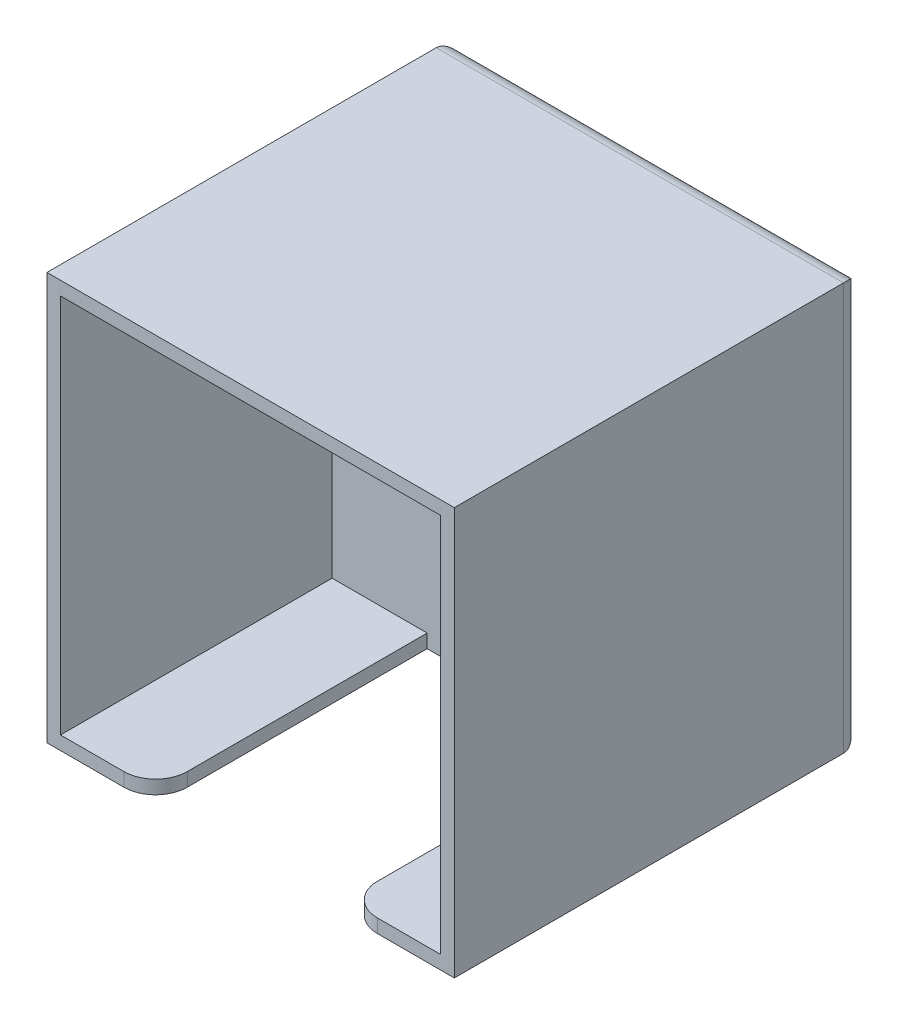
ISO-10303-21;
HEADER;
FILE_DESCRIPTION(('STEP AP214'),'2;1');
FILE_NAME('part.step','',(''),(''),'','','');
FILE_SCHEMA(('AUTOMOTIVE_DESIGN { 1 0 10303 214 1 1 1 1 }'));
ENDSEC;
DATA;
#1=APPLICATION_CONTEXT('core data for automotive mechanical design processes');
#2=APPLICATION_PROTOCOL_DEFINITION('international standard','automotive_design',2000,#1);
#3=PRODUCT_CONTEXT('',#1,'mechanical');
#4=PRODUCT('Part','Part','',(#3));
#5=PRODUCT_RELATED_PRODUCT_CATEGORY('part','',(#4));
#6=PRODUCT_DEFINITION_FORMATION('','',#4);
#7=PRODUCT_DEFINITION_CONTEXT('part definition',#1,'design');
#8=PRODUCT_DEFINITION('design','',#6,#7);
#9=PRODUCT_DEFINITION_SHAPE('','',#8);
#10=(LENGTH_UNIT() NAMED_UNIT(*) SI_UNIT(.MILLI.,.METRE.));
#11=(NAMED_UNIT(*) PLANE_ANGLE_UNIT() SI_UNIT($,.RADIAN.));
#12=(NAMED_UNIT(*) SI_UNIT($,.STERADIAN.) SOLID_ANGLE_UNIT());
#13=UNCERTAINTY_MEASURE_WITH_UNIT(LENGTH_MEASURE(1.E-05),#10,'distance_accuracy_value','');
#14=(GEOMETRIC_REPRESENTATION_CONTEXT(3) GLOBAL_UNCERTAINTY_ASSIGNED_CONTEXT((#13)) GLOBAL_UNIT_ASSIGNED_CONTEXT((#10,
#11,#12)) REPRESENTATION_CONTEXT('',''));
#15=CARTESIAN_POINT('',(0.,0.,0.));
#16=DIRECTION('',(0.,0.,1.));
#17=DIRECTION('',(1.,0.,0.));
#18=AXIS2_PLACEMENT_3D('',#15,#16,#17);
#19=CARTESIAN_POINT('',(-21.,-21.,15.));
#20=DIRECTION('',(0.,-1.,0.));
#21=DIRECTION('',(0.,0.,-1.));
#22=AXIS2_PLACEMENT_3D('',#19,#20,#21);
#23=PLANE('',#22);
#24=DIRECTION('',(0.,0.,-1.));
#25=VECTOR('',#24,1.);
#26=CARTESIAN_POINT('',(10.5,-21.,15.));
#27=LINE('',#26,#25);
#28=CARTESIAN_POINT('',(10.5,-21.,41.5));
#29=VERTEX_POINT('',#28);
#30=CARTESIAN_POINT('',(10.5,-21.,15.));
#31=VERTEX_POINT('',#30);
#32=EDGE_CURVE('E282',#29,#31,#27,.T.);
#33=ORIENTED_EDGE('',*,*,#32,.F.);
#34=CARTESIAN_POINT('',(14.,-21.,41.5));
#35=DIRECTION('',(0.,-1.,0.));
#36=DIRECTION('',(0.,0.,-1.));
#37=AXIS2_PLACEMENT_3D('',#34,#35,#36);
#38=CIRCLE('',#37,3.5);
#39=CARTESIAN_POINT('',(14.,-21.,45.));
#40=VERTEX_POINT('',#39);
#41=EDGE_CURVE('E248',#29,#40,#38,.F.);
#42=ORIENTED_EDGE('',*,*,#41,.T.);
#43=DIRECTION('',(1.,0.,0.));
#44=VECTOR('',#43,1.);
#45=CARTESIAN_POINT('',(-21.,-21.,45.));
#46=LINE('',#45,#44);
#47=CARTESIAN_POINT('',(21.,-21.,45.));
#48=VERTEX_POINT('',#47);
#49=EDGE_CURVE('E205',#40,#48,#46,.T.);
#50=ORIENTED_EDGE('',*,*,#49,.T.);
#51=DIRECTION('',(0.,0.,1.));
#52=VECTOR('',#51,1.);
#53=CARTESIAN_POINT('',(21.,-21.,15.));
#54=LINE('',#53,#52);
#55=CARTESIAN_POINT('',(21.,-21.,15.));
#56=VERTEX_POINT('',#55);
#57=EDGE_CURVE('E208',#56,#48,#54,.T.);
#58=ORIENTED_EDGE('',*,*,#57,.F.);
#59=DIRECTION('',(1.,0.,0.));
#60=VECTOR('',#59,1.);
#61=CARTESIAN_POINT('',(-21.,-21.,15.));
#62=LINE('',#61,#60);
#63=EDGE_CURVE('E195',#31,#56,#62,.T.);
#64=ORIENTED_EDGE('',*,*,#63,.F.);
#65=EDGE_LOOP('',(#33,#42,#50,#58,#64));
#66=FACE_BOUND('',#65,.T.);
#67=ADVANCED_FACE('F41',(#66),#23,.F.);
#68=CARTESIAN_POINT('',(22.5,-22.5,45.));
#69=DIRECTION('',(-1.,0.,0.));
#70=DIRECTION('',(0.,0.,1.));
#71=AXIS2_PLACEMENT_3D('',#68,#69,#70);
#72=PLANE('',#71);
#73=DIRECTION('',(0.,0.,-1.));
#74=VECTOR('',#73,1.);
#75=CARTESIAN_POINT('',(22.5,-22.5,45.));
#76=LINE('',#75,#74);
#77=CARTESIAN_POINT('',(22.5,-22.5,45.));
#78=VERTEX_POINT('',#77);
#79=CARTESIAN_POINT('',(22.5,-22.5,2.00000000000002));
#80=VERTEX_POINT('',#79);
#81=EDGE_CURVE('E228',#78,#80,#76,.T.);
#82=ORIENTED_EDGE('',*,*,#81,.T.);
#83=DIRECTION('',(0.,1.,0.));
#84=VECTOR('',#83,1.);
#85=CARTESIAN_POINT('',(22.5,22.5,2.));
#86=LINE('',#85,#84);
#87=CARTESIAN_POINT('',(22.5,22.5,2.00000000000002));
#88=VERTEX_POINT('',#87);
#89=EDGE_CURVE('E50',#80,#88,#86,.T.);
#90=ORIENTED_EDGE('',*,*,#89,.T.);
#91=DIRECTION('',(0.,0.,-1.));
#92=VECTOR('',#91,1.);
#93=CARTESIAN_POINT('',(22.5,22.5,45.));
#94=LINE('',#93,#92);
#95=CARTESIAN_POINT('',(22.5,22.5,45.));
#96=VERTEX_POINT('',#95);
#97=EDGE_CURVE('E235',#96,#88,#94,.T.);
#98=ORIENTED_EDGE('',*,*,#97,.F.);
#99=DIRECTION('',(0.,1.,0.));
#100=VECTOR('',#99,1.);
#101=CARTESIAN_POINT('',(22.5,-22.5,45.));
#102=LINE('',#101,#100);
#103=EDGE_CURVE('E211',#78,#96,#102,.T.);
#104=ORIENTED_EDGE('',*,*,#103,.F.);
#105=EDGE_LOOP('',(#82,#90,#98,#104));
#106=FACE_BOUND('',#105,.T.);
#107=ADVANCED_FACE('F340',(#106),#72,.F.);
#108=CARTESIAN_POINT('',(-22.5,22.5,45.));
#109=DIRECTION('',(0.,-1.,0.));
#110=DIRECTION('',(0.,0.,-1.));
#111=AXIS2_PLACEMENT_3D('',#108,#109,#110);
#112=PLANE('',#111);
#113=ORIENTED_EDGE('',*,*,#97,.T.);
#114=DIRECTION('',(-1.,0.,0.));
#115=VECTOR('',#114,1.);
#116=CARTESIAN_POINT('',(-22.5,22.5,2.));
#117=LINE('',#116,#115);
#118=CARTESIAN_POINT('',(-22.5,22.5,2.00000000000002));
#119=VERTEX_POINT('',#118);
#120=EDGE_CURVE('E265',#88,#119,#117,.T.);
#121=ORIENTED_EDGE('',*,*,#120,.T.);
#122=DIRECTION('',(0.,0.,-1.));
#123=VECTOR('',#122,1.);
#124=CARTESIAN_POINT('',(-22.5,22.5,45.));
#125=LINE('',#124,#123);
#126=CARTESIAN_POINT('',(-22.5,22.5,45.));
#127=VERTEX_POINT('',#126);
#128=EDGE_CURVE('E232',#127,#119,#125,.T.);
#129=ORIENTED_EDGE('',*,*,#128,.F.);
#130=DIRECTION('',(-1.,0.,0.));
#131=VECTOR('',#130,1.);
#132=CARTESIAN_POINT('',(-22.5,22.5,45.));
#133=LINE('',#132,#131);
#134=EDGE_CURVE('E220',#96,#127,#133,.T.);
#135=ORIENTED_EDGE('',*,*,#134,.F.);
#136=EDGE_LOOP('',(#113,#121,#129,#135));
#137=FACE_BOUND('',#136,.T.);
#138=ADVANCED_FACE('F347',(#137),#112,.F.);
#139=CARTESIAN_POINT('',(-22.5,-22.5,45.));
#140=DIRECTION('',(1.,0.,0.));
#141=DIRECTION('',(0.,0.,-1.));
#142=AXIS2_PLACEMENT_3D('',#139,#140,#141);
#143=PLANE('',#142);
#144=ORIENTED_EDGE('',*,*,#128,.T.);
#145=DIRECTION('',(0.,-1.,0.));
#146=VECTOR('',#145,1.);
#147=CARTESIAN_POINT('',(-22.5,-22.5,2.));
#148=LINE('',#147,#146);
#149=CARTESIAN_POINT('',(-22.5,-22.5,2.00000000000002));
#150=VERTEX_POINT('',#149);
#151=EDGE_CURVE('E253',#119,#150,#148,.T.);
#152=ORIENTED_EDGE('',*,*,#151,.T.);
#153=DIRECTION('',(0.,0.,-1.));
#154=VECTOR('',#153,1.);
#155=CARTESIAN_POINT('',(-22.5,-22.5,45.));
#156=LINE('',#155,#154);
#157=CARTESIAN_POINT('',(-22.5,-22.5,45.));
#158=VERTEX_POINT('',#157);
#159=EDGE_CURVE('E230',#158,#150,#156,.T.);
#160=ORIENTED_EDGE('',*,*,#159,.F.);
#161=DIRECTION('',(0.,-1.,0.));
#162=VECTOR('',#161,1.);
#163=CARTESIAN_POINT('',(-22.5,-22.5,45.));
#164=LINE('',#163,#162);
#165=EDGE_CURVE('E222',#127,#158,#164,.T.);
#166=ORIENTED_EDGE('',*,*,#165,.F.);
#167=EDGE_LOOP('',(#144,#152,#160,#166));
#168=FACE_BOUND('',#167,.T.);
#169=ADVANCED_FACE('F323',(#168),#143,.F.);
#170=CARTESIAN_POINT('',(-22.5,-22.5,45.));
#171=DIRECTION('',(0.,1.,0.));
#172=DIRECTION('',(0.,0.,1.));
#173=AXIS2_PLACEMENT_3D('',#170,#171,#172);
#174=PLANE('',#173);
#175=ORIENTED_EDGE('',*,*,#159,.T.);
#176=DIRECTION('',(1.,0.,0.));
#177=VECTOR('',#176,1.);
#178=CARTESIAN_POINT('',(22.5,-22.5,2.));
#179=LINE('',#178,#177);
#180=EDGE_CURVE('E11',#150,#80,#179,.T.);
#181=ORIENTED_EDGE('',*,*,#180,.T.);
#182=ORIENTED_EDGE('',*,*,#81,.F.);
#183=DIRECTION('',(1.,0.,0.));
#184=VECTOR('',#183,1.);
#185=CARTESIAN_POINT('',(-22.5,-22.5,45.));
#186=LINE('',#185,#184);
#187=CARTESIAN_POINT('',(14.,-22.5,45.));
#188=VERTEX_POINT('',#187);
#189=EDGE_CURVE('E224',#188,#78,#186,.T.);
#190=ORIENTED_EDGE('',*,*,#189,.F.);
#191=CARTESIAN_POINT('',(14.,-22.5,41.5));
#192=DIRECTION('',(0.,1.,0.));
#193=DIRECTION('',(0.,0.,1.));
#194=AXIS2_PLACEMENT_3D('',#191,#192,#193);
#195=CIRCLE('',#194,3.5);
#196=CARTESIAN_POINT('',(10.5,-22.5,41.5));
#197=VERTEX_POINT('',#196);
#198=EDGE_CURVE('E244',#188,#197,#195,.F.);
#199=ORIENTED_EDGE('',*,*,#198,.T.);
#200=DIRECTION('',(0.,0.,1.));
#201=VECTOR('',#200,1.);
#202=CARTESIAN_POINT('',(10.5,-22.5,15.));
#203=LINE('',#202,#201);
#204=CARTESIAN_POINT('',(10.5,-22.5,15.));
#205=VERTEX_POINT('',#204);
#206=EDGE_CURVE('E166',#205,#197,#203,.T.);
#207=ORIENTED_EDGE('',*,*,#206,.F.);
#208=DIRECTION('',(1.,0.,0.));
#209=VECTOR('',#208,1.);
#210=CARTESIAN_POINT('',(-10.5,-22.5,15.));
#211=LINE('',#210,#209);
#212=CARTESIAN_POINT('',(-10.5,-22.5,15.));
#213=VERTEX_POINT('',#212);
#214=EDGE_CURVE('E165',#213,#205,#211,.T.);
#215=ORIENTED_EDGE('',*,*,#214,.F.);
#216=DIRECTION('',(0.,0.,-1.));
#217=VECTOR('',#216,1.);
#218=CARTESIAN_POINT('',(-10.5,-22.5,15.));
#219=LINE('',#218,#217);
#220=CARTESIAN_POINT('',(-10.5,-22.5,41.5));
#221=VERTEX_POINT('',#220);
#222=EDGE_CURVE('E156',#221,#213,#219,.T.);
#223=ORIENTED_EDGE('',*,*,#222,.F.);
#224=CARTESIAN_POINT('',(-14.,-22.5,41.5));
#225=DIRECTION('',(0.,1.,0.));
#226=DIRECTION('',(0.,0.,1.));
#227=AXIS2_PLACEMENT_3D('',#224,#225,#226);
#228=CIRCLE('',#227,3.5);
#229=CARTESIAN_POINT('',(-14.,-22.5,45.));
#230=VERTEX_POINT('',#229);
#231=EDGE_CURVE('E242',#221,#230,#228,.F.);
#232=ORIENTED_EDGE('',*,*,#231,.T.);
#233=EDGE_CURVE('E225',#158,#230,#186,.T.);
#234=ORIENTED_EDGE('',*,*,#233,.F.);
#235=EDGE_LOOP('',(#175,#181,#182,#190,#199,#207,#215,#223,#232,#234));
#236=FACE_BOUND('',#235,.T.);
#237=ADVANCED_FACE('F180',(#236),#174,.F.);
#238=CARTESIAN_POINT('',(0.,0.,45.));
#239=DIRECTION('',(0.,0.,-1.));
#240=DIRECTION('',(-1.,0.,0.));
#241=AXIS2_PLACEMENT_3D('',#238,#239,#240);
#242=PLANE('',#241);
#243=ORIENTED_EDGE('',*,*,#49,.F.);
#244=DIRECTION('',(0.,-1.,0.));
#245=VECTOR('',#244,1.);
#246=CARTESIAN_POINT('',(14.,0.,45.));
#247=LINE('',#246,#245);
#248=EDGE_CURVE('E239',#40,#188,#247,.T.);
#249=ORIENTED_EDGE('',*,*,#248,.T.);
#250=ORIENTED_EDGE('',*,*,#189,.T.);
#251=ORIENTED_EDGE('',*,*,#103,.T.);
#252=ORIENTED_EDGE('',*,*,#134,.T.);
#253=ORIENTED_EDGE('',*,*,#165,.T.);
#254=ORIENTED_EDGE('',*,*,#233,.T.);
#255=DIRECTION('',(0.,-1.,0.));
#256=VECTOR('',#255,1.);
#257=CARTESIAN_POINT('',(-14.,0.,45.));
#258=LINE('',#257,#256);
#259=CARTESIAN_POINT('',(-14.,-21.,45.));
#260=VERTEX_POINT('',#259);
#261=EDGE_CURVE('E237',#230,#260,#258,.F.);
#262=ORIENTED_EDGE('',*,*,#261,.T.);
#263=CARTESIAN_POINT('',(-21.,-21.,45.));
#264=VERTEX_POINT('',#263);
#265=EDGE_CURVE('E190',#264,#260,#46,.T.);
#266=ORIENTED_EDGE('',*,*,#265,.F.);
#267=DIRECTION('',(0.,-1.,0.));
#268=VECTOR('',#267,1.);
#269=CARTESIAN_POINT('',(-21.,-21.,45.));
#270=LINE('',#269,#268);
#271=CARTESIAN_POINT('',(-21.,21.,45.));
#272=VERTEX_POINT('',#271);
#273=EDGE_CURVE('E202',#272,#264,#270,.T.);
#274=ORIENTED_EDGE('',*,*,#273,.F.);
#275=DIRECTION('',(-1.,0.,0.));
#276=VECTOR('',#275,1.);
#277=CARTESIAN_POINT('',(-21.,21.,45.));
#278=LINE('',#277,#276);
#279=CARTESIAN_POINT('',(21.,21.,45.));
#280=VERTEX_POINT('',#279);
#281=EDGE_CURVE('E199',#280,#272,#278,.T.);
#282=ORIENTED_EDGE('',*,*,#281,.F.);
#283=DIRECTION('',(0.,1.,0.));
#284=VECTOR('',#283,1.);
#285=CARTESIAN_POINT('',(21.,-21.,45.));
#286=LINE('',#285,#284);
#287=EDGE_CURVE('E185',#48,#280,#286,.T.);
#288=ORIENTED_EDGE('',*,*,#287,.F.);
#289=EDGE_LOOP('',(#243,#249,#250,#251,#252,#253,#254,#262,#266,#274,#282,#288));
#290=FACE_BOUND('',#289,.T.);
#291=ADVANCED_FACE('F299',(#290),#242,.F.);
#292=CARTESIAN_POINT('',(0.,0.,0.));
#293=DIRECTION('',(0.,0.,-1.));
#294=DIRECTION('',(-1.,0.,0.));
#295=AXIS2_PLACEMENT_3D('',#292,#293,#294);
#296=PLANE('',#295);
#297=DIRECTION('',(1.,0.,0.));
#298=VECTOR('',#297,1.);
#299=CARTESIAN_POINT('',(-22.5,-20.5,0.));
#300=LINE('',#299,#298);
#301=CARTESIAN_POINT('',(20.5,-20.5,0.));
#302=VERTEX_POINT('',#301);
#303=CARTESIAN_POINT('',(-20.5,-20.5,0.));
#304=VERTEX_POINT('',#303);
#305=EDGE_CURVE('E256',#302,#304,#300,.F.);
#306=ORIENTED_EDGE('',*,*,#305,.T.);
#307=DIRECTION('',(0.,-1.,0.));
#308=VECTOR('',#307,1.);
#309=CARTESIAN_POINT('',(-20.5,22.5,0.));
#310=LINE('',#309,#308);
#311=CARTESIAN_POINT('',(-20.5,20.5,0.));
#312=VERTEX_POINT('',#311);
#313=EDGE_CURVE('E262',#304,#312,#310,.F.);
#314=ORIENTED_EDGE('',*,*,#313,.T.);
#315=DIRECTION('',(-1.,0.,0.));
#316=VECTOR('',#315,1.);
#317=CARTESIAN_POINT('',(22.5,20.5,0.));
#318=LINE('',#317,#316);
#319=CARTESIAN_POINT('',(20.5,20.5,0.));
#320=VERTEX_POINT('',#319);
#321=EDGE_CURVE('E260',#312,#320,#318,.F.);
#322=ORIENTED_EDGE('',*,*,#321,.T.);
#323=DIRECTION('',(0.,1.,0.));
#324=VECTOR('',#323,1.);
#325=CARTESIAN_POINT('',(20.5,-22.5,0.));
#326=LINE('',#325,#324);
#327=EDGE_CURVE('E258',#320,#302,#326,.F.);
#328=ORIENTED_EDGE('',*,*,#327,.T.);
#329=EDGE_LOOP('',(#306,#314,#322,#328));
#330=FACE_BOUND('',#329,.T.);
#331=ADVANCED_FACE('F358',(#330),#296,.T.);
#332=CARTESIAN_POINT('',(21.,-21.,15.));
#333=DIRECTION('',(1.,0.,0.));
#334=DIRECTION('',(0.,0.,-1.));
#335=AXIS2_PLACEMENT_3D('',#332,#333,#334);
#336=PLANE('',#335);
#337=ORIENTED_EDGE('',*,*,#287,.T.);
#338=DIRECTION('',(0.,0.,1.));
#339=VECTOR('',#338,1.);
#340=CARTESIAN_POINT('',(21.,21.,15.));
#341=LINE('',#340,#339);
#342=CARTESIAN_POINT('',(21.,21.,15.));
#343=VERTEX_POINT('',#342);
#344=EDGE_CURVE('E197',#343,#280,#341,.T.);
#345=ORIENTED_EDGE('',*,*,#344,.F.);
#346=DIRECTION('',(0.,1.,0.));
#347=VECTOR('',#346,1.);
#348=CARTESIAN_POINT('',(21.,-21.,15.));
#349=LINE('',#348,#347);
#350=EDGE_CURVE('E187',#56,#343,#349,.T.);
#351=ORIENTED_EDGE('',*,*,#350,.F.);
#352=ORIENTED_EDGE('',*,*,#57,.T.);
#353=EDGE_LOOP('',(#337,#345,#351,#352));
#354=FACE_BOUND('',#353,.T.);
#355=ADVANCED_FACE('F304',(#354),#336,.F.);
#356=ORIENTED_EDGE('',*,*,#265,.T.);
#357=CARTESIAN_POINT('',(-14.,-21.,41.5));
#358=DIRECTION('',(0.,-1.,0.));
#359=DIRECTION('',(0.,0.,-1.));
#360=AXIS2_PLACEMENT_3D('',#357,#358,#359);
#361=CIRCLE('',#360,3.5);
#362=CARTESIAN_POINT('',(-10.5,-21.,41.5));
#363=VERTEX_POINT('',#362);
#364=EDGE_CURVE('E251',#260,#363,#361,.F.);
#365=ORIENTED_EDGE('',*,*,#364,.T.);
#366=DIRECTION('',(0.,0.,1.));
#367=VECTOR('',#366,1.);
#368=CARTESIAN_POINT('',(-10.5,-21.,15.));
#369=LINE('',#368,#367);
#370=CARTESIAN_POINT('',(-10.5,-21.,15.));
#371=VERTEX_POINT('',#370);
#372=EDGE_CURVE('E277',#371,#363,#369,.T.);
#373=ORIENTED_EDGE('',*,*,#372,.F.);
#374=CARTESIAN_POINT('',(-21.,-21.,15.));
#375=VERTEX_POINT('',#374);
#376=EDGE_CURVE('E177',#375,#371,#62,.T.);
#377=ORIENTED_EDGE('',*,*,#376,.F.);
#378=DIRECTION('',(0.,0.,1.));
#379=VECTOR('',#378,1.);
#380=CARTESIAN_POINT('',(-21.,-21.,15.));
#381=LINE('',#380,#379);
#382=EDGE_CURVE('E212',#375,#264,#381,.T.);
#383=ORIENTED_EDGE('',*,*,#382,.T.);
#384=EDGE_LOOP('',(#356,#365,#373,#377,#383));
#385=FACE_BOUND('',#384,.T.);
#386=ADVANCED_FACE('F312',(#385),#23,.F.);
#387=CARTESIAN_POINT('',(-21.,-21.,15.));
#388=DIRECTION('',(-1.,0.,0.));
#389=DIRECTION('',(0.,0.,1.));
#390=AXIS2_PLACEMENT_3D('',#387,#388,#389);
#391=PLANE('',#390);
#392=ORIENTED_EDGE('',*,*,#273,.T.);
#393=ORIENTED_EDGE('',*,*,#382,.F.);
#394=DIRECTION('',(0.,-1.,0.));
#395=VECTOR('',#394,1.);
#396=CARTESIAN_POINT('',(-21.,-21.,15.));
#397=LINE('',#396,#395);
#398=CARTESIAN_POINT('',(-21.,21.,15.));
#399=VERTEX_POINT('',#398);
#400=EDGE_CURVE('E193',#399,#375,#397,.T.);
#401=ORIENTED_EDGE('',*,*,#400,.F.);
#402=DIRECTION('',(0.,0.,1.));
#403=VECTOR('',#402,1.);
#404=CARTESIAN_POINT('',(-21.,21.,15.));
#405=LINE('',#404,#403);
#406=EDGE_CURVE('E214',#399,#272,#405,.T.);
#407=ORIENTED_EDGE('',*,*,#406,.T.);
#408=EDGE_LOOP('',(#392,#393,#401,#407));
#409=FACE_BOUND('',#408,.T.);
#410=ADVANCED_FACE('F352',(#409),#391,.F.);
#411=CARTESIAN_POINT('',(-21.,21.,15.));
#412=DIRECTION('',(0.,1.,0.));
#413=DIRECTION('',(-1.,0.,0.));
#414=AXIS2_PLACEMENT_3D('',#411,#412,#413);
#415=PLANE('',#414);
#416=ORIENTED_EDGE('',*,*,#281,.T.);
#417=ORIENTED_EDGE('',*,*,#406,.F.);
#418=DIRECTION('',(-1.,0.,0.));
#419=VECTOR('',#418,1.);
#420=CARTESIAN_POINT('',(-21.,21.,15.));
#421=LINE('',#420,#419);
#422=EDGE_CURVE('E189',#343,#399,#421,.T.);
#423=ORIENTED_EDGE('',*,*,#422,.F.);
#424=ORIENTED_EDGE('',*,*,#344,.T.);
#425=EDGE_LOOP('',(#416,#417,#423,#424));
#426=FACE_BOUND('',#425,.T.);
#427=ADVANCED_FACE('F308',(#426),#415,.F.);
#428=CARTESIAN_POINT('',(0.,0.,15.));
#429=DIRECTION('',(0.,0.,-1.));
#430=DIRECTION('',(-1.,0.,0.));
#431=AXIS2_PLACEMENT_3D('',#428,#429,#430);
#432=PLANE('',#431);
#433=ORIENTED_EDGE('',*,*,#350,.T.);
#434=ORIENTED_EDGE('',*,*,#422,.T.);
#435=ORIENTED_EDGE('',*,*,#400,.T.);
#436=ORIENTED_EDGE('',*,*,#376,.T.);
#437=DIRECTION('',(0.,-1.,0.));
#438=VECTOR('',#437,1.);
#439=CARTESIAN_POINT('',(-10.5,22.501,15.));
#440=LINE('',#439,#438);
#441=EDGE_CURVE('E160',#371,#213,#440,.T.);
#442=ORIENTED_EDGE('',*,*,#441,.T.);
#443=ORIENTED_EDGE('',*,*,#214,.T.);
#444=DIRECTION('',(0.,-1.,0.));
#445=VECTOR('',#444,1.);
#446=CARTESIAN_POINT('',(10.5,22.501,15.));
#447=LINE('',#446,#445);
#448=EDGE_CURVE('E178',#31,#205,#447,.T.);
#449=ORIENTED_EDGE('',*,*,#448,.F.);
#450=ORIENTED_EDGE('',*,*,#63,.T.);
#451=EDGE_LOOP('',(#433,#434,#435,#436,#442,#443,#449,#450));
#452=FACE_BOUND('',#451,.T.);
#453=ADVANCED_FACE('F172',(#452),#432,.F.);
#454=CARTESIAN_POINT('',(10.5,22.501,15.));
#455=DIRECTION('',(1.,0.,0.));
#456=DIRECTION('',(0.,0.,-1.));
#457=AXIS2_PLACEMENT_3D('',#454,#455,#456);
#458=PLANE('',#457);
#459=ORIENTED_EDGE('',*,*,#206,.T.);
#460=DIRECTION('',(0.,-1.,0.));
#461=VECTOR('',#460,1.);
#462=CARTESIAN_POINT('',(10.5,22.501,41.5));
#463=LINE('',#462,#461);
#464=EDGE_CURVE('E246',#197,#29,#463,.F.);
#465=ORIENTED_EDGE('',*,*,#464,.T.);
#466=ORIENTED_EDGE('',*,*,#32,.T.);
#467=ORIENTED_EDGE('',*,*,#448,.T.);
#468=EDGE_LOOP('',(#459,#465,#466,#467));
#469=FACE_BOUND('',#468,.T.);
#470=ADVANCED_FACE('F287',(#469),#458,.F.);
#471=CARTESIAN_POINT('',(-10.5,22.501,15.));
#472=DIRECTION('',(-1.,0.,0.));
#473=DIRECTION('',(0.,0.,1.));
#474=AXIS2_PLACEMENT_3D('',#471,#472,#473);
#475=PLANE('',#474);
#476=ORIENTED_EDGE('',*,*,#372,.T.);
#477=DIRECTION('',(0.,-1.,0.));
#478=VECTOR('',#477,1.);
#479=CARTESIAN_POINT('',(-10.5,22.501,41.5));
#480=LINE('',#479,#478);
#481=EDGE_CURVE('E163',#363,#221,#480,.T.);
#482=ORIENTED_EDGE('',*,*,#481,.T.);
#483=ORIENTED_EDGE('',*,*,#222,.T.);
#484=ORIENTED_EDGE('',*,*,#441,.F.);
#485=EDGE_LOOP('',(#476,#482,#483,#484));
#486=FACE_BOUND('',#485,.T.);
#487=ADVANCED_FACE('F159',(#486),#475,.F.);
#488=CARTESIAN_POINT('',(14.,0.,41.5));
#489=DIRECTION('',(0.,-1.,0.));
#490=DIRECTION('',(0.,0.,-1.));
#491=AXIS2_PLACEMENT_3D('',#488,#489,#490);
#492=CYLINDRICAL_SURFACE('',#491,3.5);
#493=ORIENTED_EDGE('',*,*,#41,.F.);
#494=ORIENTED_EDGE('',*,*,#464,.F.);
#495=ORIENTED_EDGE('',*,*,#198,.F.);
#496=ORIENTED_EDGE('',*,*,#248,.F.);
#497=EDGE_LOOP('',(#493,#494,#495,#496));
#498=FACE_BOUND('',#497,.T.);
#499=ADVANCED_FACE('F291',(#498),#492,.T.);
#500=CARTESIAN_POINT('',(-14.,22.501,41.5));
#501=DIRECTION('',(0.,-1.,0.));
#502=DIRECTION('',(0.,0.,-1.));
#503=AXIS2_PLACEMENT_3D('',#500,#501,#502);
#504=CYLINDRICAL_SURFACE('',#503,3.5);
#505=ORIENTED_EDGE('',*,*,#364,.F.);
#506=ORIENTED_EDGE('',*,*,#261,.F.);
#507=ORIENTED_EDGE('',*,*,#231,.F.);
#508=ORIENTED_EDGE('',*,*,#481,.F.);
#509=EDGE_LOOP('',(#505,#506,#507,#508));
#510=FACE_BOUND('',#509,.T.);
#511=ADVANCED_FACE('F317',(#510),#504,.T.);
#512=CARTESIAN_POINT('',(20.5,-22.5,2.));
#513=DIRECTION('',(0.,-1.,0.));
#514=DIRECTION('',(0.,0.,-1.));
#515=AXIS2_PLACEMENT_3D('',#512,#513,#514);
#516=CYLINDRICAL_SURFACE('',#515,2.);
#517=CARTESIAN_POINT('',(20.5,-20.5,2.));
#518=DIRECTION('',(-0.707106781186547,-0.707106781186547,0.));
#519=DIRECTION('',(-0.707106781186547,0.707106781186547,0.));
#520=AXIS2_PLACEMENT_3D('',#517,#518,#519);
#521=ELLIPSE('',#520,2.82842712474619,2.);
#522=EDGE_CURVE('E271',#302,#80,#521,.T.);
#523=ORIENTED_EDGE('',*,*,#522,.F.);
#524=ORIENTED_EDGE('',*,*,#327,.F.);
#525=CARTESIAN_POINT('',(20.5,20.5,2.));
#526=DIRECTION('',(0.707106781186547,-0.707106781186547,0.));
#527=DIRECTION('',(-0.707106781186547,-0.707106781186547,0.));
#528=AXIS2_PLACEMENT_3D('',#525,#526,#527);
#529=ELLIPSE('',#528,2.82842712474619,2.);
#530=EDGE_CURVE('E45',#88,#320,#529,.F.);
#531=ORIENTED_EDGE('',*,*,#530,.F.);
#532=ORIENTED_EDGE('',*,*,#89,.F.);
#533=EDGE_LOOP('',(#523,#524,#531,#532));
#534=FACE_BOUND('',#533,.T.);
#535=ADVANCED_FACE('F43',(#534),#516,.T.);
#536=CARTESIAN_POINT('',(-22.5,20.5,2.));
#537=DIRECTION('',(1.,0.,0.));
#538=DIRECTION('',(0.,0.,-1.));
#539=AXIS2_PLACEMENT_3D('',#536,#537,#538);
#540=CYLINDRICAL_SURFACE('',#539,2.);
#541=ORIENTED_EDGE('',*,*,#530,.T.);
#542=ORIENTED_EDGE('',*,*,#321,.F.);
#543=CARTESIAN_POINT('',(-20.5,20.5,2.));
#544=DIRECTION('',(0.707106781186547,0.707106781186547,0.));
#545=DIRECTION('',(0.707106781186547,-0.707106781186547,0.));
#546=AXIS2_PLACEMENT_3D('',#543,#544,#545);
#547=ELLIPSE('',#546,2.82842712474619,2.);
#548=EDGE_CURVE('E270',#119,#312,#547,.F.);
#549=ORIENTED_EDGE('',*,*,#548,.F.);
#550=ORIENTED_EDGE('',*,*,#120,.F.);
#551=EDGE_LOOP('',(#541,#542,#549,#550));
#552=FACE_BOUND('',#551,.T.);
#553=ADVANCED_FACE('F332',(#552),#540,.T.);
#554=CARTESIAN_POINT('',(-22.5,-20.5,2.));
#555=DIRECTION('',(-1.,0.,0.));
#556=DIRECTION('',(0.,0.,1.));
#557=AXIS2_PLACEMENT_3D('',#554,#555,#556);
#558=CYLINDRICAL_SURFACE('',#557,2.);
#559=ORIENTED_EDGE('',*,*,#522,.T.);
#560=ORIENTED_EDGE('',*,*,#180,.F.);
#561=CARTESIAN_POINT('',(-20.5,-20.5,2.));
#562=DIRECTION('',(-0.707106781186547,0.707106781186547,0.));
#563=DIRECTION('',(-0.707106781186547,-0.707106781186547,0.));
#564=AXIS2_PLACEMENT_3D('',#561,#562,#563);
#565=ELLIPSE('',#564,2.82842712474619,2.);
#566=EDGE_CURVE('E268',#304,#150,#565,.T.);
#567=ORIENTED_EDGE('',*,*,#566,.F.);
#568=ORIENTED_EDGE('',*,*,#305,.F.);
#569=EDGE_LOOP('',(#559,#560,#567,#568));
#570=FACE_BOUND('',#569,.T.);
#571=ADVANCED_FACE('F330',(#570),#558,.T.);
#572=CARTESIAN_POINT('',(-20.5,-22.5,2.));
#573=DIRECTION('',(0.,1.,0.));
#574=DIRECTION('',(0.,0.,1.));
#575=AXIS2_PLACEMENT_3D('',#572,#573,#574);
#576=CYLINDRICAL_SURFACE('',#575,2.);
#577=ORIENTED_EDGE('',*,*,#548,.T.);
#578=ORIENTED_EDGE('',*,*,#313,.F.);
#579=ORIENTED_EDGE('',*,*,#566,.T.);
#580=ORIENTED_EDGE('',*,*,#151,.F.);
#581=EDGE_LOOP('',(#577,#578,#579,#580));
#582=FACE_BOUND('',#581,.T.);
#583=ADVANCED_FACE('F327',(#582),#576,.T.);
#584=CLOSED_SHELL('',(#67,#107,#138,#169,#237,#291,#331,#355,#386,#410,#427,#453,#470,#487,#499,
#511,#535,#553,#571,#583));
#585=MANIFOLD_SOLID_BREP('B2',#584);
#586=ADVANCED_BREP_SHAPE_REPRESENTATION('',(#18,#585),#14);
#587=SHAPE_DEFINITION_REPRESENTATION(#9,#586);
ENDSEC;
END-ISO-10303-21;
